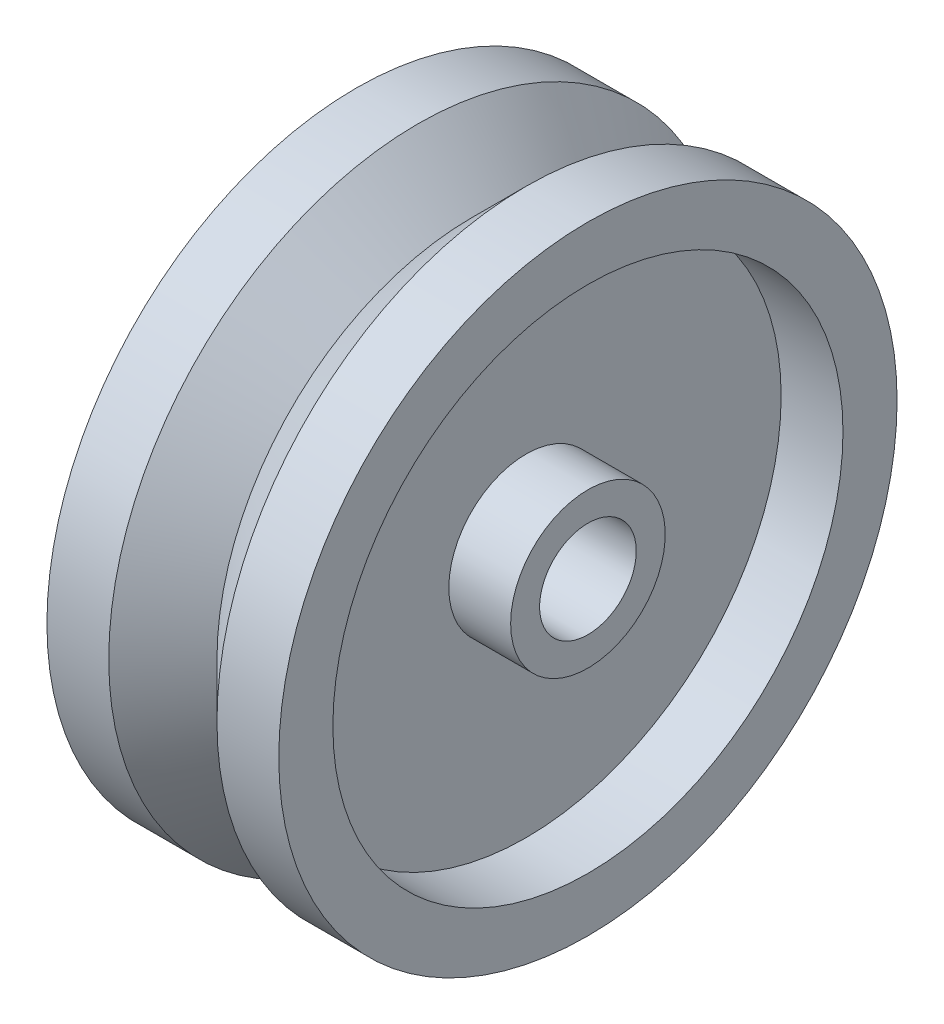
ISO-10303-21;
HEADER;
FILE_DESCRIPTION(('STEP AP214'),'2;1');
FILE_NAME('part.step','',(''),(''),'','','');
FILE_SCHEMA(('AUTOMOTIVE_DESIGN { 1 0 10303 214 1 1 1 1 }'));
ENDSEC;
DATA;
#1=APPLICATION_CONTEXT('core data for automotive mechanical design processes');
#2=APPLICATION_PROTOCOL_DEFINITION('international standard','automotive_design',2000,#1);
#3=PRODUCT_CONTEXT('',#1,'mechanical');
#4=PRODUCT('Part','Part','',(#3));
#5=PRODUCT_RELATED_PRODUCT_CATEGORY('part','',(#4));
#6=PRODUCT_DEFINITION_FORMATION('','',#4);
#7=PRODUCT_DEFINITION_CONTEXT('part definition',#1,'design');
#8=PRODUCT_DEFINITION('design','',#6,#7);
#9=PRODUCT_DEFINITION_SHAPE('','',#8);
#10=(LENGTH_UNIT() NAMED_UNIT(*) SI_UNIT(.MILLI.,.METRE.));
#11=(NAMED_UNIT(*) PLANE_ANGLE_UNIT() SI_UNIT($,.RADIAN.));
#12=(NAMED_UNIT(*) SI_UNIT($,.STERADIAN.) SOLID_ANGLE_UNIT());
#13=UNCERTAINTY_MEASURE_WITH_UNIT(LENGTH_MEASURE(1.E-05),#10,'distance_accuracy_value','');
#14=(GEOMETRIC_REPRESENTATION_CONTEXT(3) GLOBAL_UNCERTAINTY_ASSIGNED_CONTEXT((#13)) GLOBAL_UNIT_ASSIGNED_CONTEXT((#10,
#11,#12)) REPRESENTATION_CONTEXT('',''));
#15=CARTESIAN_POINT('',(0.,0.,0.));
#16=DIRECTION('',(0.,0.,1.));
#17=DIRECTION('',(1.,0.,0.));
#18=AXIS2_PLACEMENT_3D('',#15,#16,#17);
#19=CARTESIAN_POINT('',(7.5,0.,0.));
#20=DIRECTION('',(-1.,0.,0.));
#21=DIRECTION('',(0.,0.,1.));
#22=AXIS2_PLACEMENT_3D('',#19,#20,#21);
#23=CYLINDRICAL_SURFACE('',#22,20.);
#24=CARTESIAN_POINT('',(-7.5,0.,0.));
#25=DIRECTION('',(1.,0.,0.));
#26=DIRECTION('',(0.,0.,-1.));
#27=AXIS2_PLACEMENT_3D('',#24,#25,#26);
#28=CIRCLE('',#27,20.);
#29=CARTESIAN_POINT('',(-7.5,0.,-20.));
#30=VERTEX_POINT('',#29);
#31=EDGE_CURVE('E51',#30,#30,#28,.T.);
#32=ORIENTED_EDGE('',*,*,#31,.T.);
#33=EDGE_LOOP('',(#32));
#34=FACE_BOUND('',#33,.T.);
#35=CARTESIAN_POINT('',(-3.5,0.,0.));
#36=DIRECTION('',(-1.,0.,0.));
#37=DIRECTION('',(0.,0.,1.));
#38=AXIS2_PLACEMENT_3D('',#35,#36,#37);
#39=CIRCLE('',#38,20.);
#40=CARTESIAN_POINT('',(-3.5,0.,20.));
#41=VERTEX_POINT('',#40);
#42=EDGE_CURVE('E88',#41,#41,#39,.T.);
#43=ORIENTED_EDGE('',*,*,#42,.T.);
#44=EDGE_LOOP('',(#43));
#45=FACE_BOUND('',#44,.T.);
#46=ADVANCED_FACE('F43',(#34,#45),#23,.T.);
#47=CARTESIAN_POINT('',(7.5,0.,0.));
#48=DIRECTION('',(1.,0.,0.));
#49=DIRECTION('',(0.,0.,-1.));
#50=AXIS2_PLACEMENT_3D('',#47,#48,#49);
#51=CIRCLE('',#50,20.);
#52=CARTESIAN_POINT('',(7.5,0.,-20.));
#53=VERTEX_POINT('',#52);
#54=EDGE_CURVE('E10',#53,#53,#51,.T.);
#55=ORIENTED_EDGE('',*,*,#54,.F.);
#56=EDGE_LOOP('',(#55));
#57=FACE_BOUND('',#56,.T.);
#58=CARTESIAN_POINT('',(3.5,0.,0.));
#59=DIRECTION('',(-1.,0.,0.));
#60=DIRECTION('',(0.,0.,1.));
#61=AXIS2_PLACEMENT_3D('',#58,#59,#60);
#62=CIRCLE('',#61,20.);
#63=CARTESIAN_POINT('',(3.5,0.,20.));
#64=VERTEX_POINT('',#63);
#65=EDGE_CURVE('E141',#64,#64,#62,.T.);
#66=ORIENTED_EDGE('',*,*,#65,.F.);
#67=EDGE_LOOP('',(#66));
#68=FACE_BOUND('',#67,.T.);
#69=ADVANCED_FACE('F125',(#57,#68),#23,.T.);
#70=CARTESIAN_POINT('',(-7.5,0.,0.));
#71=DIRECTION('',(1.,0.,0.));
#72=DIRECTION('',(0.,0.,-1.));
#73=AXIS2_PLACEMENT_3D('',#70,#71,#72);
#74=PLANE('',#73);
#75=CARTESIAN_POINT('',(-7.5,0.,0.));
#76=DIRECTION('',(1.,0.,0.));
#77=DIRECTION('',(0.,0.,-1.));
#78=AXIS2_PLACEMENT_3D('',#75,#76,#77);
#79=CIRCLE('',#78,3.125);
#80=CARTESIAN_POINT('',(-7.5,0.,-3.125));
#81=VERTEX_POINT('',#80);
#82=EDGE_CURVE('E60',#81,#81,#79,.T.);
#83=ORIENTED_EDGE('',*,*,#82,.T.);
#84=EDGE_LOOP('',(#83));
#85=FACE_BOUND('',#84,.T.);
#86=CARTESIAN_POINT('',(-7.5,0.,0.));
#87=DIRECTION('',(1.,0.,0.));
#88=DIRECTION('',(0.,0.,-1.));
#89=AXIS2_PLACEMENT_3D('',#86,#87,#88);
#90=CIRCLE('',#89,5.);
#91=CARTESIAN_POINT('',(-7.5,0.,-5.));
#92=VERTEX_POINT('',#91);
#93=EDGE_CURVE('E71',#92,#92,#90,.T.);
#94=ORIENTED_EDGE('',*,*,#93,.F.);
#95=EDGE_LOOP('',(#94));
#96=FACE_BOUND('',#95,.T.);
#97=ADVANCED_FACE('F105',(#85,#96),#74,.F.);
#98=CARTESIAN_POINT('',(7.5,0.,0.));
#99=DIRECTION('',(1.,0.,0.));
#100=DIRECTION('',(0.,0.,-1.));
#101=AXIS2_PLACEMENT_3D('',#98,#99,#100);
#102=PLANE('',#101);
#103=CARTESIAN_POINT('',(7.5,0.,0.));
#104=DIRECTION('',(1.,0.,0.));
#105=DIRECTION('',(0.,0.,-1.));
#106=AXIS2_PLACEMENT_3D('',#103,#104,#105);
#107=CIRCLE('',#106,3.125);
#108=CARTESIAN_POINT('',(7.5,0.,-3.125));
#109=VERTEX_POINT('',#108);
#110=EDGE_CURVE('E57',#109,#109,#107,.T.);
#111=ORIENTED_EDGE('',*,*,#110,.F.);
#112=EDGE_LOOP('',(#111));
#113=FACE_BOUND('',#112,.T.);
#114=CARTESIAN_POINT('',(7.5,0.,0.));
#115=DIRECTION('',(1.,0.,0.));
#116=DIRECTION('',(0.,0.,-1.));
#117=AXIS2_PLACEMENT_3D('',#114,#115,#116);
#118=CIRCLE('',#117,5.);
#119=CARTESIAN_POINT('',(7.5,0.,5.));
#120=VERTEX_POINT('',#119);
#121=EDGE_CURVE('E63',#120,#120,#118,.F.);
#122=ORIENTED_EDGE('',*,*,#121,.F.);
#123=EDGE_LOOP('',(#122));
#124=FACE_BOUND('',#123,.T.);
#125=ADVANCED_FACE('F186',(#113,#124),#102,.T.);
#126=CARTESIAN_POINT('',(7.5,0.,0.));
#127=DIRECTION('',(1.,0.,0.));
#128=DIRECTION('',(0.,0.,-1.));
#129=AXIS2_PLACEMENT_3D('',#126,#127,#128);
#130=CIRCLE('',#129,16.5);
#131=CARTESIAN_POINT('',(7.5,0.,16.5));
#132=VERTEX_POINT('',#131);
#133=EDGE_CURVE('E67',#132,#132,#130,.F.);
#134=ORIENTED_EDGE('',*,*,#133,.T.);
#135=EDGE_LOOP('',(#134));
#136=FACE_BOUND('',#135,.T.);
#137=ORIENTED_EDGE('',*,*,#54,.T.);
#138=EDGE_LOOP('',(#137));
#139=FACE_BOUND('',#138,.T.);
#140=ADVANCED_FACE('F121',(#136,#139),#102,.T.);
#141=CARTESIAN_POINT('',(-7.5,0.,0.));
#142=DIRECTION('',(1.,0.,0.));
#143=DIRECTION('',(0.,0.,-1.));
#144=AXIS2_PLACEMENT_3D('',#141,#142,#143);
#145=CIRCLE('',#144,16.5);
#146=CARTESIAN_POINT('',(-7.5,0.,-16.5));
#147=VERTEX_POINT('',#146);
#148=EDGE_CURVE('E46',#147,#147,#145,.T.);
#149=ORIENTED_EDGE('',*,*,#148,.T.);
#150=EDGE_LOOP('',(#149));
#151=FACE_BOUND('',#150,.T.);
#152=ORIENTED_EDGE('',*,*,#31,.F.);
#153=EDGE_LOOP('',(#152));
#154=FACE_BOUND('',#153,.T.);
#155=ADVANCED_FACE('F111',(#151,#154),#74,.F.);
#156=CARTESIAN_POINT('',(7.5,0.,0.));
#157=DIRECTION('',(-1.,0.,0.));
#158=DIRECTION('',(0.,0.,1.));
#159=AXIS2_PLACEMENT_3D('',#156,#157,#158);
#160=CYLINDRICAL_SURFACE('',#159,3.125);
#161=ORIENTED_EDGE('',*,*,#110,.T.);
#162=EDGE_LOOP('',(#161));
#163=FACE_BOUND('',#162,.T.);
#164=ORIENTED_EDGE('',*,*,#82,.F.);
#165=EDGE_LOOP('',(#164));
#166=FACE_BOUND('',#165,.T.);
#167=ADVANCED_FACE('F108',(#163,#166),#160,.F.);
#168=CARTESIAN_POINT('',(7.500012,0.,0.));
#169=DIRECTION('',(-1.,0.,0.));
#170=DIRECTION('',(0.,0.,1.));
#171=AXIS2_PLACEMENT_3D('',#168,#169,#170);
#172=CYLINDRICAL_SURFACE('',#171,16.5);
#173=CARTESIAN_POINT('',(3.5,0.,0.));
#174=DIRECTION('',(1.,0.,0.));
#175=DIRECTION('',(0.,0.,-1.));
#176=AXIS2_PLACEMENT_3D('',#173,#174,#175);
#177=CIRCLE('',#176,16.5);
#178=CARTESIAN_POINT('',(3.5,0.,16.5));
#179=VERTEX_POINT('',#178);
#180=EDGE_CURVE('E68',#179,#179,#177,.T.);
#181=CARTESIAN_POINT('',(7.5,0.,16.5));
#182=CARTESIAN_POINT('',(7.45833333333333,0.,16.5));
#183=CARTESIAN_POINT('',(7.41666666666667,0.,16.5));
#184=CARTESIAN_POINT('',(7.33333333333333,0.,16.5));
#185=CARTESIAN_POINT('',(7.29166666666667,0.,16.5));
#186=CARTESIAN_POINT('',(7.20833333333333,0.,16.5));
#187=CARTESIAN_POINT('',(7.16666666666667,0.,16.5));
#188=CARTESIAN_POINT('',(7.08333333333333,0.,16.5));
#189=CARTESIAN_POINT('',(7.04166666666667,0.,16.5));
#190=CARTESIAN_POINT('',(6.95833333333333,0.,16.5));
#191=CARTESIAN_POINT('',(6.91666666666667,0.,16.5));
#192=CARTESIAN_POINT('',(6.83333333333333,0.,16.5));
#193=CARTESIAN_POINT('',(6.79166666666667,0.,16.5));
#194=CARTESIAN_POINT('',(6.70833333333333,0.,16.5));
#195=CARTESIAN_POINT('',(6.66666666666667,0.,16.5));
#196=CARTESIAN_POINT('',(6.58333333333333,0.,16.5));
#197=CARTESIAN_POINT('',(6.54166666666667,0.,16.5));
#198=CARTESIAN_POINT('',(6.45833333333333,0.,16.5));
#199=CARTESIAN_POINT('',(6.41666666666667,0.,16.5));
#200=CARTESIAN_POINT('',(6.33333333333333,0.,16.5));
#201=CARTESIAN_POINT('',(6.29166666666667,0.,16.5));
#202=CARTESIAN_POINT('',(6.20833333333333,0.,16.5));
#203=CARTESIAN_POINT('',(6.16666666666667,0.,16.5));
#204=CARTESIAN_POINT('',(6.08333333333333,0.,16.5));
#205=CARTESIAN_POINT('',(6.04166666666667,0.,16.5));
#206=CARTESIAN_POINT('',(5.95833333333333,0.,16.5));
#207=CARTESIAN_POINT('',(5.91666666666667,0.,16.5));
#208=CARTESIAN_POINT('',(5.83333333333333,0.,16.5));
#209=CARTESIAN_POINT('',(5.79166666666667,0.,16.5));
#210=CARTESIAN_POINT('',(5.70833333333333,0.,16.5));
#211=CARTESIAN_POINT('',(5.66666666666667,0.,16.5));
#212=CARTESIAN_POINT('',(5.58333333333333,0.,16.5));
#213=CARTESIAN_POINT('',(5.54166666666667,0.,16.5));
#214=CARTESIAN_POINT('',(5.45833333333333,0.,16.5));
#215=CARTESIAN_POINT('',(5.41666666666667,0.,16.5));
#216=CARTESIAN_POINT('',(5.33333333333333,0.,16.5));
#217=CARTESIAN_POINT('',(5.29166666666667,0.,16.5));
#218=CARTESIAN_POINT('',(5.20833333333333,0.,16.5));
#219=CARTESIAN_POINT('',(5.16666666666667,0.,16.5));
#220=CARTESIAN_POINT('',(5.08333333333333,0.,16.5));
#221=CARTESIAN_POINT('',(5.04166666666667,0.,16.5));
#222=CARTESIAN_POINT('',(4.95833333333333,0.,16.5));
#223=CARTESIAN_POINT('',(4.91666666666667,0.,16.5));
#224=CARTESIAN_POINT('',(4.83333333333333,0.,16.5));
#225=CARTESIAN_POINT('',(4.79166666666667,0.,16.5));
#226=CARTESIAN_POINT('',(4.70833333333333,0.,16.5));
#227=CARTESIAN_POINT('',(4.66666666666667,0.,16.5));
#228=CARTESIAN_POINT('',(4.58333333333333,0.,16.5));
#229=CARTESIAN_POINT('',(4.54166666666667,0.,16.5));
#230=CARTESIAN_POINT('',(4.45833333333333,0.,16.5));
#231=CARTESIAN_POINT('',(4.41666666666667,0.,16.5));
#232=CARTESIAN_POINT('',(4.33333333333333,0.,16.5));
#233=CARTESIAN_POINT('',(4.29166666666667,0.,16.5));
#234=CARTESIAN_POINT('',(4.20833333333333,0.,16.5));
#235=CARTESIAN_POINT('',(4.16666666666667,0.,16.5));
#236=CARTESIAN_POINT('',(4.08333333333333,0.,16.5));
#237=CARTESIAN_POINT('',(4.04166666666667,0.,16.5));
#238=CARTESIAN_POINT('',(3.95833333333333,0.,16.5));
#239=CARTESIAN_POINT('',(3.91666666666667,0.,16.5));
#240=CARTESIAN_POINT('',(3.83333333333333,0.,16.5));
#241=CARTESIAN_POINT('',(3.79166666666667,0.,16.5));
#242=CARTESIAN_POINT('',(3.70833333333333,0.,16.5));
#243=CARTESIAN_POINT('',(3.66666666666667,0.,16.5));
#244=CARTESIAN_POINT('',(3.58333333333333,0.,16.5));
#245=CARTESIAN_POINT('',(3.54166666666667,0.,16.5));
#246=CARTESIAN_POINT('',(3.5,0.,16.5));
#247=B_SPLINE_CURVE_WITH_KNOTS('',3,(#181,#182,#183,#184,#185,#186,#187,#188,#189,#190,#191,
#192,#193,#194,#195,#196,#197,#198,#199,#200,#201,#202,#203,#204,#205,#206,#207,#208,#209,#210,
#211,#212,#213,#214,#215,#216,#217,#218,#219,#220,#221,#222,#223,#224,#225,#226,#227,#228,#229,
#230,#231,#232,#233,#234,#235,#236,#237,#238,#239,#240,#241,#242,#243,#244,#245,#246),
.UNSPECIFIED.,.F.,.F.,(4,2,2,2,2,2,2,2,2,2,2,2,2,2,2,2,2,2,2,2,2,2,2,2,2,2,2,2,2,2,2,2,4),(0.,
0.124999999999999,0.249999999999999,0.374999999999999,0.5,0.625,0.75,0.875,0.999999999999999,
1.125,1.25,1.375,1.5,1.625,1.75,1.875,2.,2.125,2.25,2.375,2.5,2.625,2.75,2.875,3.,3.125,3.25,
3.375,3.5,3.625,3.75,3.875,4.),.UNSPECIFIED.);
#248=EDGE_CURVE('BSEAM110',#132,#179,#247,.T.);
#249=ORIENTED_EDGE('',*,*,#133,.F.);
#250=ORIENTED_EDGE('',*,*,#180,.F.);
#251=ORIENTED_EDGE('',*,*,#248,.T.);
#252=ORIENTED_EDGE('',*,*,#248,.F.);
#253=EDGE_LOOP('',(#249,#251,#250,#252));
#254=FACE_BOUND('',#253,.T.);
#255=ADVANCED_FACE('F110',(#254),#172,.F.);
#256=CARTESIAN_POINT('',(7.500012,0.,0.));
#257=DIRECTION('',(-1.,0.,0.));
#258=DIRECTION('',(0.,0.,1.));
#259=AXIS2_PLACEMENT_3D('',#256,#257,#258);
#260=CYLINDRICAL_SURFACE('',#259,5.);
#261=CARTESIAN_POINT('',(3.5,0.,0.));
#262=DIRECTION('',(1.,0.,0.));
#263=DIRECTION('',(0.,0.,-1.));
#264=AXIS2_PLACEMENT_3D('',#261,#262,#263);
#265=CIRCLE('',#264,5.);
#266=CARTESIAN_POINT('',(3.5,0.,5.));
#267=VERTEX_POINT('',#266);
#268=EDGE_CURVE('E80',#267,#267,#265,.T.);
#269=CARTESIAN_POINT('',(7.5,0.,5.));
#270=CARTESIAN_POINT('',(7.45833333333333,0.,5.));
#271=CARTESIAN_POINT('',(7.41666666666667,0.,5.));
#272=CARTESIAN_POINT('',(7.33333333333333,0.,5.));
#273=CARTESIAN_POINT('',(7.29166666666667,0.,5.));
#274=CARTESIAN_POINT('',(7.20833333333333,0.,5.));
#275=CARTESIAN_POINT('',(7.16666666666667,0.,5.));
#276=CARTESIAN_POINT('',(7.08333333333333,0.,5.));
#277=CARTESIAN_POINT('',(7.04166666666667,0.,5.));
#278=CARTESIAN_POINT('',(6.95833333333333,0.,5.));
#279=CARTESIAN_POINT('',(6.91666666666667,0.,5.));
#280=CARTESIAN_POINT('',(6.83333333333333,0.,5.));
#281=CARTESIAN_POINT('',(6.79166666666667,0.,5.));
#282=CARTESIAN_POINT('',(6.70833333333333,0.,5.));
#283=CARTESIAN_POINT('',(6.66666666666667,0.,5.));
#284=CARTESIAN_POINT('',(6.58333333333333,0.,5.));
#285=CARTESIAN_POINT('',(6.54166666666667,0.,5.));
#286=CARTESIAN_POINT('',(6.45833333333333,0.,5.));
#287=CARTESIAN_POINT('',(6.41666666666667,0.,5.));
#288=CARTESIAN_POINT('',(6.33333333333333,0.,5.));
#289=CARTESIAN_POINT('',(6.29166666666667,0.,5.));
#290=CARTESIAN_POINT('',(6.20833333333333,0.,5.));
#291=CARTESIAN_POINT('',(6.16666666666667,0.,5.));
#292=CARTESIAN_POINT('',(6.08333333333333,0.,5.));
#293=CARTESIAN_POINT('',(6.04166666666667,0.,5.));
#294=CARTESIAN_POINT('',(5.95833333333333,0.,5.));
#295=CARTESIAN_POINT('',(5.91666666666667,0.,5.));
#296=CARTESIAN_POINT('',(5.83333333333333,0.,5.));
#297=CARTESIAN_POINT('',(5.79166666666667,0.,5.));
#298=CARTESIAN_POINT('',(5.70833333333333,0.,5.));
#299=CARTESIAN_POINT('',(5.66666666666667,0.,5.));
#300=CARTESIAN_POINT('',(5.58333333333333,0.,5.));
#301=CARTESIAN_POINT('',(5.54166666666667,0.,5.));
#302=CARTESIAN_POINT('',(5.45833333333333,0.,5.));
#303=CARTESIAN_POINT('',(5.41666666666667,0.,5.));
#304=CARTESIAN_POINT('',(5.33333333333333,0.,5.));
#305=CARTESIAN_POINT('',(5.29166666666667,0.,5.));
#306=CARTESIAN_POINT('',(5.20833333333333,0.,5.));
#307=CARTESIAN_POINT('',(5.16666666666667,0.,5.));
#308=CARTESIAN_POINT('',(5.08333333333333,0.,5.));
#309=CARTESIAN_POINT('',(5.04166666666667,0.,5.));
#310=CARTESIAN_POINT('',(4.95833333333333,0.,5.));
#311=CARTESIAN_POINT('',(4.91666666666667,0.,5.));
#312=CARTESIAN_POINT('',(4.83333333333333,0.,5.));
#313=CARTESIAN_POINT('',(4.79166666666667,0.,5.));
#314=CARTESIAN_POINT('',(4.70833333333333,0.,5.));
#315=CARTESIAN_POINT('',(4.66666666666667,0.,5.));
#316=CARTESIAN_POINT('',(4.58333333333333,0.,5.));
#317=CARTESIAN_POINT('',(4.54166666666667,0.,5.));
#318=CARTESIAN_POINT('',(4.45833333333333,0.,5.));
#319=CARTESIAN_POINT('',(4.41666666666667,0.,5.));
#320=CARTESIAN_POINT('',(4.33333333333333,0.,5.));
#321=CARTESIAN_POINT('',(4.29166666666667,0.,5.));
#322=CARTESIAN_POINT('',(4.20833333333333,0.,5.));
#323=CARTESIAN_POINT('',(4.16666666666667,0.,5.));
#324=CARTESIAN_POINT('',(4.08333333333333,0.,5.));
#325=CARTESIAN_POINT('',(4.04166666666667,0.,5.));
#326=CARTESIAN_POINT('',(3.95833333333333,0.,5.));
#327=CARTESIAN_POINT('',(3.91666666666667,0.,5.));
#328=CARTESIAN_POINT('',(3.83333333333333,0.,5.));
#329=CARTESIAN_POINT('',(3.79166666666667,0.,5.));
#330=CARTESIAN_POINT('',(3.70833333333333,0.,5.));
#331=CARTESIAN_POINT('',(3.66666666666667,0.,5.));
#332=CARTESIAN_POINT('',(3.58333333333333,0.,5.));
#333=CARTESIAN_POINT('',(3.54166666666667,0.,5.));
#334=CARTESIAN_POINT('',(3.5,0.,5.));
#335=B_SPLINE_CURVE_WITH_KNOTS('',3,(#269,#270,#271,#272,#273,#274,#275,#276,#277,#278,#279,
#280,#281,#282,#283,#284,#285,#286,#287,#288,#289,#290,#291,#292,#293,#294,#295,#296,#297,#298,
#299,#300,#301,#302,#303,#304,#305,#306,#307,#308,#309,#310,#311,#312,#313,#314,#315,#316,#317,
#318,#319,#320,#321,#322,#323,#324,#325,#326,#327,#328,#329,#330,#331,#332,#333,#334),
.UNSPECIFIED.,.F.,.F.,(4,2,2,2,2,2,2,2,2,2,2,2,2,2,2,2,2,2,2,2,2,2,2,2,2,2,2,2,2,2,2,2,4),(0.,
0.124999999999999,0.249999999999999,0.374999999999999,0.5,0.625,0.75,0.875,0.999999999999999,
1.125,1.25,1.375,1.5,1.625,1.75,1.875,2.,2.125,2.25,2.375,2.5,2.625,2.75,2.875,3.,3.125,3.25,
3.375,3.5,3.625,3.75,3.875,4.),.UNSPECIFIED.);
#336=EDGE_CURVE('BSEAM117',#120,#267,#335,.T.);
#337=ORIENTED_EDGE('',*,*,#121,.T.);
#338=ORIENTED_EDGE('',*,*,#268,.T.);
#339=ORIENTED_EDGE('',*,*,#336,.T.);
#340=ORIENTED_EDGE('',*,*,#336,.F.);
#341=EDGE_LOOP('',(#337,#339,#338,#340));
#342=FACE_BOUND('',#341,.T.);
#343=ADVANCED_FACE('F117',(#342),#260,.T.);
#344=CARTESIAN_POINT('',(3.5,0.,0.));
#345=DIRECTION('',(1.,0.,0.));
#346=DIRECTION('',(0.,0.,-1.));
#347=AXIS2_PLACEMENT_3D('',#344,#345,#346);
#348=PLANE('',#347);
#349=ORIENTED_EDGE('',*,*,#268,.F.);
#350=EDGE_LOOP('',(#349));
#351=FACE_BOUND('',#350,.T.);
#352=ORIENTED_EDGE('',*,*,#180,.T.);
#353=EDGE_LOOP('',(#352));
#354=FACE_BOUND('',#353,.T.);
#355=ADVANCED_FACE('F171',(#351,#354),#348,.T.);
#356=CARTESIAN_POINT('',(-7.500012,0.,0.));
#357=DIRECTION('',(1.,0.,0.));
#358=DIRECTION('',(0.,0.,-1.));
#359=AXIS2_PLACEMENT_3D('',#356,#357,#358);
#360=CYLINDRICAL_SURFACE('',#359,16.5);
#361=CARTESIAN_POINT('',(-3.5,0.,0.));
#362=DIRECTION('',(1.,0.,0.));
#363=DIRECTION('',(0.,0.,-1.));
#364=AXIS2_PLACEMENT_3D('',#361,#362,#363);
#365=CIRCLE('',#364,16.5);
#366=CARTESIAN_POINT('',(-3.5,0.,-16.5));
#367=VERTEX_POINT('',#366);
#368=EDGE_CURVE('E74',#367,#367,#365,.T.);
#369=CARTESIAN_POINT('',(-3.5,0.,-16.5));
#370=CARTESIAN_POINT('',(-3.54166666666667,0.,-16.5));
#371=CARTESIAN_POINT('',(-3.58333333333333,0.,-16.5));
#372=CARTESIAN_POINT('',(-3.66666666666667,0.,-16.5));
#373=CARTESIAN_POINT('',(-3.70833333333333,0.,-16.5));
#374=CARTESIAN_POINT('',(-3.79166666666667,0.,-16.5));
#375=CARTESIAN_POINT('',(-3.83333333333333,0.,-16.5));
#376=CARTESIAN_POINT('',(-3.91666666666667,0.,-16.5));
#377=CARTESIAN_POINT('',(-3.95833333333333,0.,-16.5));
#378=CARTESIAN_POINT('',(-4.04166666666667,0.,-16.5));
#379=CARTESIAN_POINT('',(-4.08333333333333,0.,-16.5));
#380=CARTESIAN_POINT('',(-4.16666666666667,0.,-16.5));
#381=CARTESIAN_POINT('',(-4.20833333333333,0.,-16.5));
#382=CARTESIAN_POINT('',(-4.29166666666667,0.,-16.5));
#383=CARTESIAN_POINT('',(-4.33333333333333,0.,-16.5));
#384=CARTESIAN_POINT('',(-4.41666666666667,0.,-16.5));
#385=CARTESIAN_POINT('',(-4.45833333333333,0.,-16.5));
#386=CARTESIAN_POINT('',(-4.54166666666667,0.,-16.5));
#387=CARTESIAN_POINT('',(-4.58333333333333,0.,-16.5));
#388=CARTESIAN_POINT('',(-4.66666666666667,0.,-16.5));
#389=CARTESIAN_POINT('',(-4.70833333333333,0.,-16.5));
#390=CARTESIAN_POINT('',(-4.79166666666667,0.,-16.5));
#391=CARTESIAN_POINT('',(-4.83333333333333,0.,-16.5));
#392=CARTESIAN_POINT('',(-4.91666666666667,0.,-16.5));
#393=CARTESIAN_POINT('',(-4.95833333333333,0.,-16.5));
#394=CARTESIAN_POINT('',(-5.04166666666667,0.,-16.5));
#395=CARTESIAN_POINT('',(-5.08333333333333,0.,-16.5));
#396=CARTESIAN_POINT('',(-5.16666666666667,0.,-16.5));
#397=CARTESIAN_POINT('',(-5.20833333333333,0.,-16.5));
#398=CARTESIAN_POINT('',(-5.29166666666667,0.,-16.5));
#399=CARTESIAN_POINT('',(-5.33333333333333,0.,-16.5));
#400=CARTESIAN_POINT('',(-5.41666666666667,0.,-16.5));
#401=CARTESIAN_POINT('',(-5.45833333333333,0.,-16.5));
#402=CARTESIAN_POINT('',(-5.54166666666667,0.,-16.5));
#403=CARTESIAN_POINT('',(-5.58333333333333,0.,-16.5));
#404=CARTESIAN_POINT('',(-5.66666666666667,0.,-16.5));
#405=CARTESIAN_POINT('',(-5.70833333333333,0.,-16.5));
#406=CARTESIAN_POINT('',(-5.79166666666667,0.,-16.5));
#407=CARTESIAN_POINT('',(-5.83333333333333,0.,-16.5));
#408=CARTESIAN_POINT('',(-5.91666666666667,0.,-16.5));
#409=CARTESIAN_POINT('',(-5.95833333333333,0.,-16.5));
#410=CARTESIAN_POINT('',(-6.04166666666667,0.,-16.5));
#411=CARTESIAN_POINT('',(-6.08333333333333,0.,-16.5));
#412=CARTESIAN_POINT('',(-6.16666666666667,0.,-16.5));
#413=CARTESIAN_POINT('',(-6.20833333333333,0.,-16.5));
#414=CARTESIAN_POINT('',(-6.29166666666667,0.,-16.5));
#415=CARTESIAN_POINT('',(-6.33333333333333,0.,-16.5));
#416=CARTESIAN_POINT('',(-6.41666666666667,0.,-16.5));
#417=CARTESIAN_POINT('',(-6.45833333333333,0.,-16.5));
#418=CARTESIAN_POINT('',(-6.54166666666667,0.,-16.5));
#419=CARTESIAN_POINT('',(-6.58333333333333,0.,-16.5));
#420=CARTESIAN_POINT('',(-6.66666666666667,0.,-16.5));
#421=CARTESIAN_POINT('',(-6.70833333333333,0.,-16.5));
#422=CARTESIAN_POINT('',(-6.79166666666667,0.,-16.5));
#423=CARTESIAN_POINT('',(-6.83333333333333,0.,-16.5));
#424=CARTESIAN_POINT('',(-6.91666666666667,0.,-16.5));
#425=CARTESIAN_POINT('',(-6.95833333333333,0.,-16.5));
#426=CARTESIAN_POINT('',(-7.04166666666667,0.,-16.5));
#427=CARTESIAN_POINT('',(-7.08333333333333,0.,-16.5));
#428=CARTESIAN_POINT('',(-7.16666666666667,0.,-16.5));
#429=CARTESIAN_POINT('',(-7.20833333333333,0.,-16.5));
#430=CARTESIAN_POINT('',(-7.29166666666667,0.,-16.5));
#431=CARTESIAN_POINT('',(-7.33333333333333,0.,-16.5));
#432=CARTESIAN_POINT('',(-7.41666666666667,0.,-16.5));
#433=CARTESIAN_POINT('',(-7.45833333333333,0.,-16.5));
#434=CARTESIAN_POINT('',(-7.5,0.,-16.5));
#435=B_SPLINE_CURVE_WITH_KNOTS('',3,(#369,#370,#371,#372,#373,#374,#375,#376,#377,#378,#379,
#380,#381,#382,#383,#384,#385,#386,#387,#388,#389,#390,#391,#392,#393,#394,#395,#396,#397,#398,
#399,#400,#401,#402,#403,#404,#405,#406,#407,#408,#409,#410,#411,#412,#413,#414,#415,#416,#417,
#418,#419,#420,#421,#422,#423,#424,#425,#426,#427,#428,#429,#430,#431,#432,#433,#434),
.UNSPECIFIED.,.F.,.F.,(4,2,2,2,2,2,2,2,2,2,2,2,2,2,2,2,2,2,2,2,2,2,2,2,2,2,2,2,2,2,2,2,4),(0.,
0.125,0.25,0.375,0.5,0.625000000000001,0.75,0.875,1.,1.125,1.25,1.375,1.5,1.625,1.75,1.875,2.,
2.125,2.25,2.375,2.5,2.625,2.75,2.875,3.,3.125,3.25,3.375,3.5,3.625,3.75,3.875,4.),.UNSPECIFIED.);
#436=EDGE_CURVE('BSEAM167',#367,#147,#435,.T.);
#437=ORIENTED_EDGE('',*,*,#368,.T.);
#438=ORIENTED_EDGE('',*,*,#148,.F.);
#439=ORIENTED_EDGE('',*,*,#436,.T.);
#440=ORIENTED_EDGE('',*,*,#436,.F.);
#441=EDGE_LOOP('',(#437,#439,#438,#440));
#442=FACE_BOUND('',#441,.T.);
#443=ADVANCED_FACE('F167',(#442),#360,.F.);
#444=CARTESIAN_POINT('',(-7.500012,0.,0.));
#445=DIRECTION('',(1.,0.,0.));
#446=DIRECTION('',(0.,0.,-1.));
#447=AXIS2_PLACEMENT_3D('',#444,#445,#446);
#448=CYLINDRICAL_SURFACE('',#447,5.);
#449=CARTESIAN_POINT('',(-3.5,0.,0.));
#450=DIRECTION('',(1.,0.,0.));
#451=DIRECTION('',(0.,0.,-1.));
#452=AXIS2_PLACEMENT_3D('',#449,#450,#451);
#453=CIRCLE('',#452,5.);
#454=CARTESIAN_POINT('',(-3.5,0.,-5.));
#455=VERTEX_POINT('',#454);
#456=EDGE_CURVE('E82',#455,#455,#453,.T.);
#457=CARTESIAN_POINT('',(-3.5,0.,-5.));
#458=CARTESIAN_POINT('',(-3.54166666666667,0.,-5.));
#459=CARTESIAN_POINT('',(-3.58333333333333,0.,-5.));
#460=CARTESIAN_POINT('',(-3.66666666666667,0.,-5.));
#461=CARTESIAN_POINT('',(-3.70833333333333,0.,-5.));
#462=CARTESIAN_POINT('',(-3.79166666666667,0.,-5.));
#463=CARTESIAN_POINT('',(-3.83333333333333,0.,-5.));
#464=CARTESIAN_POINT('',(-3.91666666666667,0.,-5.));
#465=CARTESIAN_POINT('',(-3.95833333333333,0.,-5.));
#466=CARTESIAN_POINT('',(-4.04166666666667,0.,-5.));
#467=CARTESIAN_POINT('',(-4.08333333333333,0.,-5.));
#468=CARTESIAN_POINT('',(-4.16666666666667,0.,-5.));
#469=CARTESIAN_POINT('',(-4.20833333333333,0.,-5.));
#470=CARTESIAN_POINT('',(-4.29166666666667,0.,-5.));
#471=CARTESIAN_POINT('',(-4.33333333333333,0.,-5.));
#472=CARTESIAN_POINT('',(-4.41666666666667,0.,-5.));
#473=CARTESIAN_POINT('',(-4.45833333333333,0.,-5.));
#474=CARTESIAN_POINT('',(-4.54166666666667,0.,-5.));
#475=CARTESIAN_POINT('',(-4.58333333333333,0.,-5.));
#476=CARTESIAN_POINT('',(-4.66666666666667,0.,-5.));
#477=CARTESIAN_POINT('',(-4.70833333333333,0.,-5.));
#478=CARTESIAN_POINT('',(-4.79166666666667,0.,-5.));
#479=CARTESIAN_POINT('',(-4.83333333333333,0.,-5.));
#480=CARTESIAN_POINT('',(-4.91666666666667,0.,-5.));
#481=CARTESIAN_POINT('',(-4.95833333333333,0.,-5.));
#482=CARTESIAN_POINT('',(-5.04166666666667,0.,-5.));
#483=CARTESIAN_POINT('',(-5.08333333333333,0.,-5.));
#484=CARTESIAN_POINT('',(-5.16666666666667,0.,-5.));
#485=CARTESIAN_POINT('',(-5.20833333333333,0.,-5.));
#486=CARTESIAN_POINT('',(-5.29166666666667,0.,-5.));
#487=CARTESIAN_POINT('',(-5.33333333333333,0.,-5.));
#488=CARTESIAN_POINT('',(-5.41666666666667,0.,-5.));
#489=CARTESIAN_POINT('',(-5.45833333333333,0.,-5.));
#490=CARTESIAN_POINT('',(-5.54166666666667,0.,-5.));
#491=CARTESIAN_POINT('',(-5.58333333333333,0.,-5.));
#492=CARTESIAN_POINT('',(-5.66666666666667,0.,-5.));
#493=CARTESIAN_POINT('',(-5.70833333333333,0.,-5.));
#494=CARTESIAN_POINT('',(-5.79166666666667,0.,-5.));
#495=CARTESIAN_POINT('',(-5.83333333333333,0.,-5.));
#496=CARTESIAN_POINT('',(-5.91666666666667,0.,-5.));
#497=CARTESIAN_POINT('',(-5.95833333333333,0.,-5.));
#498=CARTESIAN_POINT('',(-6.04166666666667,0.,-5.));
#499=CARTESIAN_POINT('',(-6.08333333333333,0.,-5.));
#500=CARTESIAN_POINT('',(-6.16666666666667,0.,-5.));
#501=CARTESIAN_POINT('',(-6.20833333333333,0.,-5.));
#502=CARTESIAN_POINT('',(-6.29166666666667,0.,-5.));
#503=CARTESIAN_POINT('',(-6.33333333333333,0.,-5.));
#504=CARTESIAN_POINT('',(-6.41666666666667,0.,-5.));
#505=CARTESIAN_POINT('',(-6.45833333333333,0.,-5.));
#506=CARTESIAN_POINT('',(-6.54166666666667,0.,-5.));
#507=CARTESIAN_POINT('',(-6.58333333333333,0.,-5.));
#508=CARTESIAN_POINT('',(-6.66666666666667,0.,-5.));
#509=CARTESIAN_POINT('',(-6.70833333333333,0.,-5.));
#510=CARTESIAN_POINT('',(-6.79166666666667,0.,-5.));
#511=CARTESIAN_POINT('',(-6.83333333333333,0.,-5.));
#512=CARTESIAN_POINT('',(-6.91666666666667,0.,-5.));
#513=CARTESIAN_POINT('',(-6.95833333333333,0.,-5.));
#514=CARTESIAN_POINT('',(-7.04166666666667,0.,-5.));
#515=CARTESIAN_POINT('',(-7.08333333333333,0.,-5.));
#516=CARTESIAN_POINT('',(-7.16666666666667,0.,-5.));
#517=CARTESIAN_POINT('',(-7.20833333333333,0.,-5.));
#518=CARTESIAN_POINT('',(-7.29166666666667,0.,-5.));
#519=CARTESIAN_POINT('',(-7.33333333333333,0.,-5.));
#520=CARTESIAN_POINT('',(-7.41666666666667,0.,-5.));
#521=CARTESIAN_POINT('',(-7.45833333333333,0.,-5.));
#522=CARTESIAN_POINT('',(-7.5,0.,-5.));
#523=B_SPLINE_CURVE_WITH_KNOTS('',3,(#457,#458,#459,#460,#461,#462,#463,#464,#465,#466,#467,
#468,#469,#470,#471,#472,#473,#474,#475,#476,#477,#478,#479,#480,#481,#482,#483,#484,#485,#486,
#487,#488,#489,#490,#491,#492,#493,#494,#495,#496,#497,#498,#499,#500,#501,#502,#503,#504,#505,
#506,#507,#508,#509,#510,#511,#512,#513,#514,#515,#516,#517,#518,#519,#520,#521,#522),
.UNSPECIFIED.,.F.,.F.,(4,2,2,2,2,2,2,2,2,2,2,2,2,2,2,2,2,2,2,2,2,2,2,2,2,2,2,2,2,2,2,2,4),(0.,
0.125,0.25,0.375,0.5,0.625000000000001,0.75,0.875,1.,1.125,1.25,1.375,1.5,1.625,1.75,1.875,2.,
2.125,2.25,2.375,2.5,2.625,2.75,2.875,3.,3.125,3.25,3.375,3.5,3.625,3.75,3.875,4.),.UNSPECIFIED.);
#524=EDGE_CURVE('BSEAM161',#455,#92,#523,.T.);
#525=ORIENTED_EDGE('',*,*,#456,.F.);
#526=ORIENTED_EDGE('',*,*,#93,.T.);
#527=ORIENTED_EDGE('',*,*,#524,.T.);
#528=ORIENTED_EDGE('',*,*,#524,.F.);
#529=EDGE_LOOP('',(#525,#527,#526,#528));
#530=FACE_BOUND('',#529,.T.);
#531=ADVANCED_FACE('F161',(#530),#448,.T.);
#532=CARTESIAN_POINT('',(-3.5,0.,0.));
#533=DIRECTION('',(-1.,0.,0.));
#534=DIRECTION('',(0.,0.,-1.));
#535=AXIS2_PLACEMENT_3D('',#532,#533,#534);
#536=PLANE('',#535);
#537=ORIENTED_EDGE('',*,*,#368,.F.);
#538=EDGE_LOOP('',(#537));
#539=FACE_BOUND('',#538,.T.);
#540=ORIENTED_EDGE('',*,*,#456,.T.);
#541=EDGE_LOOP('',(#540));
#542=FACE_BOUND('',#541,.T.);
#543=ADVANCED_FACE('F157',(#539,#542),#536,.T.);
#544=CARTESIAN_POINT('',(-3.5,0.,0.));
#545=DIRECTION('',(-1.,0.,0.));
#546=DIRECTION('',(0.,0.,1.));
#547=AXIS2_PLACEMENT_3D('',#544,#545,#546);
#548=CONICAL_SURFACE('',#547,20.,0.78539816339745);
#549=CARTESIAN_POINT('',(0.,0.,0.));
#550=DIRECTION('',(-1.,0.,0.));
#551=DIRECTION('',(0.,0.,1.));
#552=AXIS2_PLACEMENT_3D('',#549,#550,#551);
#553=CIRCLE('',#552,16.5);
#554=CARTESIAN_POINT('',(0.,0.,16.5));
#555=VERTEX_POINT('',#554);
#556=EDGE_CURVE('E138',#555,#555,#553,.T.);
#557=ORIENTED_EDGE('',*,*,#556,.T.);
#558=EDGE_LOOP('',(#557));
#559=FACE_BOUND('',#558,.T.);
#560=ORIENTED_EDGE('',*,*,#42,.F.);
#561=EDGE_LOOP('',(#560));
#562=FACE_BOUND('',#561,.T.);
#563=ADVANCED_FACE('F152',(#559,#562),#548,.T.);
#564=CARTESIAN_POINT('',(0.,0.,0.));
#565=DIRECTION('',(1.,0.,0.));
#566=DIRECTION('',(0.,0.,-1.));
#567=AXIS2_PLACEMENT_3D('',#564,#565,#566);
#568=CONICAL_SURFACE('',#567,16.5,0.78539816339745);
#569=ORIENTED_EDGE('',*,*,#65,.T.);
#570=EDGE_LOOP('',(#569));
#571=FACE_BOUND('',#570,.T.);
#572=ORIENTED_EDGE('',*,*,#556,.F.);
#573=EDGE_LOOP('',(#572));
#574=FACE_BOUND('',#573,.T.);
#575=ADVANCED_FACE('F148',(#571,#574),#568,.T.);
#576=CLOSED_SHELL('',(#46,#69,#97,#125,#140,#155,#167,#255,#343,#355,#443,#531,#543,#563,#575));
#577=MANIFOLD_SOLID_BREP('B2',#576);
#578=ADVANCED_BREP_SHAPE_REPRESENTATION('',(#18,#577),#14);
#579=SHAPE_DEFINITION_REPRESENTATION(#9,#578);
ENDSEC;
END-ISO-10303-21;
